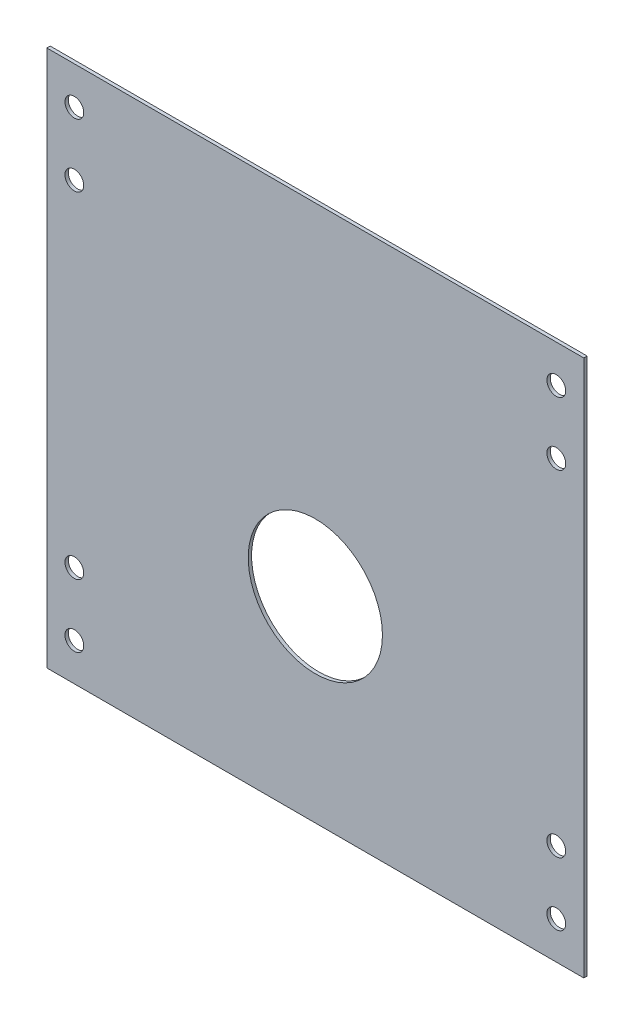
ISO-10303-21;
HEADER;
FILE_DESCRIPTION(('STEP AP214'),'2;1');
FILE_NAME('part.step','',(''),(''),'','','');
FILE_SCHEMA(('AUTOMOTIVE_DESIGN { 1 0 10303 214 1 1 1 1 }'));
ENDSEC;
DATA;
#1=APPLICATION_CONTEXT('core data for automotive mechanical design processes');
#2=APPLICATION_PROTOCOL_DEFINITION('international standard','automotive_design',2000,#1);
#3=PRODUCT_CONTEXT('',#1,'mechanical');
#4=PRODUCT('Part','Part','',(#3));
#5=PRODUCT_RELATED_PRODUCT_CATEGORY('part','',(#4));
#6=PRODUCT_DEFINITION_FORMATION('','',#4);
#7=PRODUCT_DEFINITION_CONTEXT('part definition',#1,'design');
#8=PRODUCT_DEFINITION('design','',#6,#7);
#9=PRODUCT_DEFINITION_SHAPE('','',#8);
#10=(LENGTH_UNIT() NAMED_UNIT(*) SI_UNIT(.MILLI.,.METRE.));
#11=(NAMED_UNIT(*) PLANE_ANGLE_UNIT() SI_UNIT($,.RADIAN.));
#12=(NAMED_UNIT(*) SI_UNIT($,.STERADIAN.) SOLID_ANGLE_UNIT());
#13=UNCERTAINTY_MEASURE_WITH_UNIT(LENGTH_MEASURE(1.E-05),#10,'distance_accuracy_value','');
#14=(GEOMETRIC_REPRESENTATION_CONTEXT(3) GLOBAL_UNCERTAINTY_ASSIGNED_CONTEXT((#13)) GLOBAL_UNIT_ASSIGNED_CONTEXT((#10,
#11,#12)) REPRESENTATION_CONTEXT('',''));
#15=CARTESIAN_POINT('',(0.,0.,0.));
#16=DIRECTION('',(0.,0.,1.));
#17=DIRECTION('',(1.,0.,0.));
#18=AXIS2_PLACEMENT_3D('',#15,#16,#17);
#19=CARTESIAN_POINT('',(0.,0.,2.54));
#20=DIRECTION('',(0.,0.,1.));
#21=DIRECTION('',(1.,0.,0.));
#22=AXIS2_PLACEMENT_3D('',#19,#20,#21);
#23=PLANE('',#22);
#24=CARTESIAN_POINT('',(182.372,174.752,2.54));
#25=DIRECTION('',(0.,0.,1.));
#26=DIRECTION('',(-1.,0.,0.));
#27=AXIS2_PLACEMENT_3D('',#24,#25,#26);
#28=CIRCLE('',#27,7.11200000000003);
#29=CARTESIAN_POINT('',(175.26,174.752,2.54));
#30=VERTEX_POINT('',#29);
#31=EDGE_CURVE('E150',#30,#30,#28,.T.);
#32=ORIENTED_EDGE('',*,*,#31,.F.);
#33=EDGE_LOOP('',(#32));
#34=FACE_BOUND('',#33,.T.);
#35=CARTESIAN_POINT('',(182.372,-127.,2.54));
#36=DIRECTION('',(0.,0.,1.));
#37=DIRECTION('',(1.,0.,0.));
#38=AXIS2_PLACEMENT_3D('',#35,#36,#37);
#39=CIRCLE('',#38,7.112);
#40=CARTESIAN_POINT('',(189.484,-127.,2.54));
#41=VERTEX_POINT('',#40);
#42=EDGE_CURVE('E138',#41,#41,#39,.T.);
#43=ORIENTED_EDGE('',*,*,#42,.F.);
#44=EDGE_LOOP('',(#43));
#45=FACE_BOUND('',#44,.T.);
#46=CARTESIAN_POINT('',(-182.372,-174.752,2.54));
#47=DIRECTION('',(0.,0.,1.));
#48=DIRECTION('',(-1.,0.,0.));
#49=AXIS2_PLACEMENT_3D('',#46,#47,#48);
#50=CIRCLE('',#49,7.11200000000003);
#51=CARTESIAN_POINT('',(-189.484,-174.752,2.54));
#52=VERTEX_POINT('',#51);
#53=EDGE_CURVE('E126',#52,#52,#50,.T.);
#54=ORIENTED_EDGE('',*,*,#53,.F.);
#55=EDGE_LOOP('',(#54));
#56=FACE_BOUND('',#55,.T.);
#57=CARTESIAN_POINT('',(-182.372,127.,2.54));
#58=DIRECTION('',(0.,0.,1.));
#59=DIRECTION('',(1.,0.,0.));
#60=AXIS2_PLACEMENT_3D('',#57,#58,#59);
#61=CIRCLE('',#60,7.112);
#62=CARTESIAN_POINT('',(-175.26,127.,2.54));
#63=VERTEX_POINT('',#62);
#64=EDGE_CURVE('E114',#63,#63,#61,.T.);
#65=ORIENTED_EDGE('',*,*,#64,.F.);
#66=EDGE_LOOP('',(#65));
#67=FACE_BOUND('',#66,.T.);
#68=DIRECTION('',(0.,-1.,0.));
#69=VECTOR('',#68,1.);
#70=CARTESIAN_POINT('',(-203.2,203.2,2.54));
#71=LINE('',#70,#69);
#72=CARTESIAN_POINT('',(-203.2,203.2,2.54));
#73=VERTEX_POINT('',#72);
#74=CARTESIAN_POINT('',(-203.2,-203.2,2.54));
#75=VERTEX_POINT('',#74);
#76=EDGE_CURVE('E84',#73,#75,#71,.T.);
#77=ORIENTED_EDGE('',*,*,#76,.T.);
#78=DIRECTION('',(1.,0.,0.));
#79=VECTOR('',#78,1.);
#80=CARTESIAN_POINT('',(-203.2,-203.2,2.54));
#81=LINE('',#80,#79);
#82=CARTESIAN_POINT('',(203.2,-203.2,2.54));
#83=VERTEX_POINT('',#82);
#84=EDGE_CURVE('E79',#75,#83,#81,.T.);
#85=ORIENTED_EDGE('',*,*,#84,.T.);
#86=DIRECTION('',(0.,1.,0.));
#87=VECTOR('',#86,1.);
#88=CARTESIAN_POINT('',(203.2,203.2,2.54));
#89=LINE('',#88,#87);
#90=CARTESIAN_POINT('',(203.2,203.2,2.54));
#91=VERTEX_POINT('',#90);
#92=EDGE_CURVE('E82',#83,#91,#89,.T.);
#93=ORIENTED_EDGE('',*,*,#92,.T.);
#94=DIRECTION('',(-1.,0.,0.));
#95=VECTOR('',#94,1.);
#96=CARTESIAN_POINT('',(-203.2,203.2,2.54));
#97=LINE('',#96,#95);
#98=EDGE_CURVE('E49',#91,#73,#97,.T.);
#99=ORIENTED_EDGE('',*,*,#98,.T.);
#100=EDGE_LOOP('',(#77,#85,#93,#99));
#101=FACE_BOUND('',#100,.T.);
#102=CARTESIAN_POINT('',(0.,-54.602000016,2.54));
#103=DIRECTION('',(0.,0.,1.));
#104=DIRECTION('',(1.,0.,0.));
#105=AXIS2_PLACEMENT_3D('',#102,#103,#104);
#106=CIRCLE('',#105,50.8);
#107=CARTESIAN_POINT('',(50.8,-54.602000016,2.54));
#108=VERTEX_POINT('',#107);
#109=EDGE_CURVE('E99',#108,#108,#106,.T.);
#110=ORIENTED_EDGE('',*,*,#109,.F.);
#111=EDGE_LOOP('',(#110));
#112=FACE_BOUND('',#111,.T.);
#113=CARTESIAN_POINT('',(-182.372,174.752,2.54));
#114=DIRECTION('',(0.,0.,1.));
#115=DIRECTION('',(1.,0.,0.));
#116=AXIS2_PLACEMENT_3D('',#113,#114,#115);
#117=CIRCLE('',#116,7.11200000000003);
#118=CARTESIAN_POINT('',(-175.26,174.752,2.54));
#119=VERTEX_POINT('',#118);
#120=EDGE_CURVE('E120',#119,#119,#117,.T.);
#121=ORIENTED_EDGE('',*,*,#120,.F.);
#122=EDGE_LOOP('',(#121));
#123=FACE_BOUND('',#122,.T.);
#124=CARTESIAN_POINT('',(-182.372,-127.,2.54));
#125=DIRECTION('',(0.,0.,1.));
#126=DIRECTION('',(-1.,0.,0.));
#127=AXIS2_PLACEMENT_3D('',#124,#125,#126);
#128=CIRCLE('',#127,7.112);
#129=CARTESIAN_POINT('',(-189.484,-127.,2.54));
#130=VERTEX_POINT('',#129);
#131=EDGE_CURVE('E132',#130,#130,#128,.T.);
#132=ORIENTED_EDGE('',*,*,#131,.F.);
#133=EDGE_LOOP('',(#132));
#134=FACE_BOUND('',#133,.T.);
#135=CARTESIAN_POINT('',(182.372,-174.752,2.54));
#136=DIRECTION('',(0.,0.,1.));
#137=DIRECTION('',(1.,0.,0.));
#138=AXIS2_PLACEMENT_3D('',#135,#136,#137);
#139=CIRCLE('',#138,7.11200000000003);
#140=CARTESIAN_POINT('',(189.484,-174.752,2.54));
#141=VERTEX_POINT('',#140);
#142=EDGE_CURVE('E144',#141,#141,#139,.T.);
#143=ORIENTED_EDGE('',*,*,#142,.F.);
#144=EDGE_LOOP('',(#143));
#145=FACE_BOUND('',#144,.T.);
#146=CARTESIAN_POINT('',(182.372,127.,2.54));
#147=DIRECTION('',(0.,0.,1.));
#148=DIRECTION('',(-1.,0.,0.));
#149=AXIS2_PLACEMENT_3D('',#146,#147,#148);
#150=CIRCLE('',#149,7.112);
#151=CARTESIAN_POINT('',(175.26,127.,2.54));
#152=VERTEX_POINT('',#151);
#153=EDGE_CURVE('E156',#152,#152,#150,.T.);
#154=ORIENTED_EDGE('',*,*,#153,.F.);
#155=EDGE_LOOP('',(#154));
#156=FACE_BOUND('',#155,.T.);
#157=ADVANCED_FACE('F32',(#34,#45,#56,#67,#101,#112,#123,#134,#145,#156),#23,.T.);
#158=CARTESIAN_POINT('',(0.,0.,0.));
#159=DIRECTION('',(0.,0.,1.));
#160=DIRECTION('',(1.,0.,0.));
#161=AXIS2_PLACEMENT_3D('',#158,#159,#160);
#162=PLANE('',#161);
#163=CARTESIAN_POINT('',(182.372,174.752,0.));
#164=DIRECTION('',(0.,0.,1.));
#165=DIRECTION('',(-1.,0.,0.));
#166=AXIS2_PLACEMENT_3D('',#163,#164,#165);
#167=CIRCLE('',#166,7.11200000000003);
#168=CARTESIAN_POINT('',(175.26,174.752,0.));
#169=VERTEX_POINT('',#168);
#170=EDGE_CURVE('E153',#169,#169,#167,.T.);
#171=ORIENTED_EDGE('',*,*,#170,.T.);
#172=EDGE_LOOP('',(#171));
#173=FACE_BOUND('',#172,.T.);
#174=CARTESIAN_POINT('',(182.372,-127.,0.));
#175=DIRECTION('',(0.,0.,1.));
#176=DIRECTION('',(1.,0.,0.));
#177=AXIS2_PLACEMENT_3D('',#174,#175,#176);
#178=CIRCLE('',#177,7.112);
#179=CARTESIAN_POINT('',(189.484,-127.,0.));
#180=VERTEX_POINT('',#179);
#181=EDGE_CURVE('E141',#180,#180,#178,.T.);
#182=ORIENTED_EDGE('',*,*,#181,.T.);
#183=EDGE_LOOP('',(#182));
#184=FACE_BOUND('',#183,.T.);
#185=CARTESIAN_POINT('',(-182.372,-174.752,0.));
#186=DIRECTION('',(0.,0.,1.));
#187=DIRECTION('',(-1.,0.,0.));
#188=AXIS2_PLACEMENT_3D('',#185,#186,#187);
#189=CIRCLE('',#188,7.11200000000003);
#190=CARTESIAN_POINT('',(-189.484,-174.752,0.));
#191=VERTEX_POINT('',#190);
#192=EDGE_CURVE('E129',#191,#191,#189,.T.);
#193=ORIENTED_EDGE('',*,*,#192,.T.);
#194=EDGE_LOOP('',(#193));
#195=FACE_BOUND('',#194,.T.);
#196=CARTESIAN_POINT('',(-182.372,127.,0.));
#197=DIRECTION('',(0.,0.,1.));
#198=DIRECTION('',(1.,0.,0.));
#199=AXIS2_PLACEMENT_3D('',#196,#197,#198);
#200=CIRCLE('',#199,7.112);
#201=CARTESIAN_POINT('',(-175.26,127.,0.));
#202=VERTEX_POINT('',#201);
#203=EDGE_CURVE('E117',#202,#202,#200,.T.);
#204=ORIENTED_EDGE('',*,*,#203,.T.);
#205=EDGE_LOOP('',(#204));
#206=FACE_BOUND('',#205,.T.);
#207=DIRECTION('',(0.,-1.,0.));
#208=VECTOR('',#207,1.);
#209=CARTESIAN_POINT('',(-203.2,203.2,0.));
#210=LINE('',#209,#208);
#211=CARTESIAN_POINT('',(-203.2,203.2,0.));
#212=VERTEX_POINT('',#211);
#213=CARTESIAN_POINT('',(-203.2,-203.2,0.));
#214=VERTEX_POINT('',#213);
#215=EDGE_CURVE('E96',#212,#214,#210,.T.);
#216=ORIENTED_EDGE('',*,*,#215,.F.);
#217=DIRECTION('',(-1.,0.,0.));
#218=VECTOR('',#217,1.);
#219=CARTESIAN_POINT('',(-203.2,203.2,0.));
#220=LINE('',#219,#218);
#221=CARTESIAN_POINT('',(203.2,203.2,0.));
#222=VERTEX_POINT('',#221);
#223=EDGE_CURVE('E72',#222,#212,#220,.T.);
#224=ORIENTED_EDGE('',*,*,#223,.F.);
#225=DIRECTION('',(0.,1.,0.));
#226=VECTOR('',#225,1.);
#227=CARTESIAN_POINT('',(203.2,203.2,0.));
#228=LINE('',#227,#226);
#229=CARTESIAN_POINT('',(203.2,-203.2,0.));
#230=VERTEX_POINT('',#229);
#231=EDGE_CURVE('E66',#230,#222,#228,.T.);
#232=ORIENTED_EDGE('',*,*,#231,.F.);
#233=DIRECTION('',(1.,0.,0.));
#234=VECTOR('',#233,1.);
#235=CARTESIAN_POINT('',(-203.2,-203.2,0.));
#236=LINE('',#235,#234);
#237=EDGE_CURVE('E88',#214,#230,#236,.T.);
#238=ORIENTED_EDGE('',*,*,#237,.F.);
#239=EDGE_LOOP('',(#216,#224,#232,#238));
#240=FACE_BOUND('',#239,.T.);
#241=CARTESIAN_POINT('',(0.,-54.602000016,0.));
#242=DIRECTION('',(0.,0.,1.));
#243=DIRECTION('',(1.,0.,0.));
#244=AXIS2_PLACEMENT_3D('',#241,#242,#243);
#245=CIRCLE('',#244,50.8);
#246=CARTESIAN_POINT('',(50.8,-54.602000016,0.));
#247=VERTEX_POINT('',#246);
#248=EDGE_CURVE('E111',#247,#247,#245,.T.);
#249=ORIENTED_EDGE('',*,*,#248,.T.);
#250=EDGE_LOOP('',(#249));
#251=FACE_BOUND('',#250,.T.);
#252=CARTESIAN_POINT('',(-182.372,174.752,0.));
#253=DIRECTION('',(0.,0.,1.));
#254=DIRECTION('',(1.,0.,0.));
#255=AXIS2_PLACEMENT_3D('',#252,#253,#254);
#256=CIRCLE('',#255,7.11200000000003);
#257=CARTESIAN_POINT('',(-175.26,174.752,0.));
#258=VERTEX_POINT('',#257);
#259=EDGE_CURVE('E123',#258,#258,#256,.T.);
#260=ORIENTED_EDGE('',*,*,#259,.T.);
#261=EDGE_LOOP('',(#260));
#262=FACE_BOUND('',#261,.T.);
#263=CARTESIAN_POINT('',(-182.372,-127.,0.));
#264=DIRECTION('',(0.,0.,1.));
#265=DIRECTION('',(-1.,0.,0.));
#266=AXIS2_PLACEMENT_3D('',#263,#264,#265);
#267=CIRCLE('',#266,7.112);
#268=CARTESIAN_POINT('',(-189.484,-127.,0.));
#269=VERTEX_POINT('',#268);
#270=EDGE_CURVE('E135',#269,#269,#267,.T.);
#271=ORIENTED_EDGE('',*,*,#270,.T.);
#272=EDGE_LOOP('',(#271));
#273=FACE_BOUND('',#272,.T.);
#274=CARTESIAN_POINT('',(182.372,-174.752,0.));
#275=DIRECTION('',(0.,0.,1.));
#276=DIRECTION('',(1.,0.,0.));
#277=AXIS2_PLACEMENT_3D('',#274,#275,#276);
#278=CIRCLE('',#277,7.11200000000003);
#279=CARTESIAN_POINT('',(189.484,-174.752,0.));
#280=VERTEX_POINT('',#279);
#281=EDGE_CURVE('E147',#280,#280,#278,.T.);
#282=ORIENTED_EDGE('',*,*,#281,.T.);
#283=EDGE_LOOP('',(#282));
#284=FACE_BOUND('',#283,.T.);
#285=CARTESIAN_POINT('',(182.372,127.,0.));
#286=DIRECTION('',(0.,0.,1.));
#287=DIRECTION('',(-1.,0.,0.));
#288=AXIS2_PLACEMENT_3D('',#285,#286,#287);
#289=CIRCLE('',#288,7.112);
#290=CARTESIAN_POINT('',(175.26,127.,0.));
#291=VERTEX_POINT('',#290);
#292=EDGE_CURVE('E159',#291,#291,#289,.T.);
#293=ORIENTED_EDGE('',*,*,#292,.T.);
#294=EDGE_LOOP('',(#293));
#295=FACE_BOUND('',#294,.T.);
#296=ADVANCED_FACE('F107',(#173,#184,#195,#206,#240,#251,#262,#273,#284,#295),#162,.F.);
#297=CARTESIAN_POINT('',(-203.2,203.2,2.54));
#298=DIRECTION('',(1.,0.,0.));
#299=DIRECTION('',(0.,1.,0.));
#300=AXIS2_PLACEMENT_3D('',#297,#298,#299);
#301=PLANE('',#300);
#302=ORIENTED_EDGE('',*,*,#215,.T.);
#303=DIRECTION('',(0.,0.,-1.));
#304=VECTOR('',#303,1.);
#305=CARTESIAN_POINT('',(-203.2,-203.2,2.54));
#306=LINE('',#305,#304);
#307=EDGE_CURVE('E11',#75,#214,#306,.T.);
#308=ORIENTED_EDGE('',*,*,#307,.F.);
#309=ORIENTED_EDGE('',*,*,#76,.F.);
#310=DIRECTION('',(0.,0.,-1.));
#311=VECTOR('',#310,1.);
#312=CARTESIAN_POINT('',(-203.2,203.2,2.54));
#313=LINE('',#312,#311);
#314=EDGE_CURVE('E92',#73,#212,#313,.T.);
#315=ORIENTED_EDGE('',*,*,#314,.T.);
#316=EDGE_LOOP('',(#302,#308,#309,#315));
#317=FACE_BOUND('',#316,.T.);
#318=ADVANCED_FACE('F34',(#317),#301,.F.);
#319=CARTESIAN_POINT('',(-203.2,-203.2,2.54));
#320=DIRECTION('',(0.,1.,0.));
#321=DIRECTION('',(0.,0.,1.));
#322=AXIS2_PLACEMENT_3D('',#319,#320,#321);
#323=PLANE('',#322);
#324=ORIENTED_EDGE('',*,*,#237,.T.);
#325=DIRECTION('',(0.,0.,-1.));
#326=VECTOR('',#325,1.);
#327=CARTESIAN_POINT('',(203.2,-203.2,2.54));
#328=LINE('',#327,#326);
#329=EDGE_CURVE('E41',#83,#230,#328,.T.);
#330=ORIENTED_EDGE('',*,*,#329,.F.);
#331=ORIENTED_EDGE('',*,*,#84,.F.);
#332=ORIENTED_EDGE('',*,*,#307,.T.);
#333=EDGE_LOOP('',(#324,#330,#331,#332));
#334=FACE_BOUND('',#333,.T.);
#335=ADVANCED_FACE('F87',(#334),#323,.F.);
#336=CARTESIAN_POINT('',(203.2,203.2,2.54));
#337=DIRECTION('',(-1.,0.,0.));
#338=DIRECTION('',(0.,-1.,0.));
#339=AXIS2_PLACEMENT_3D('',#336,#337,#338);
#340=PLANE('',#339);
#341=ORIENTED_EDGE('',*,*,#231,.T.);
#342=DIRECTION('',(0.,0.,-1.));
#343=VECTOR('',#342,1.);
#344=CARTESIAN_POINT('',(203.2,203.2,2.54));
#345=LINE('',#344,#343);
#346=EDGE_CURVE('E89',#91,#222,#345,.T.);
#347=ORIENTED_EDGE('',*,*,#346,.F.);
#348=ORIENTED_EDGE('',*,*,#92,.F.);
#349=ORIENTED_EDGE('',*,*,#329,.T.);
#350=EDGE_LOOP('',(#341,#347,#348,#349));
#351=FACE_BOUND('',#350,.T.);
#352=ADVANCED_FACE('F90',(#351),#340,.F.);
#353=CARTESIAN_POINT('',(-203.2,203.2,2.54));
#354=DIRECTION('',(0.,-1.,0.));
#355=DIRECTION('',(0.,0.,-1.));
#356=AXIS2_PLACEMENT_3D('',#353,#354,#355);
#357=PLANE('',#356);
#358=ORIENTED_EDGE('',*,*,#223,.T.);
#359=ORIENTED_EDGE('',*,*,#314,.F.);
#360=ORIENTED_EDGE('',*,*,#98,.F.);
#361=ORIENTED_EDGE('',*,*,#346,.T.);
#362=EDGE_LOOP('',(#358,#359,#360,#361));
#363=FACE_BOUND('',#362,.T.);
#364=ADVANCED_FACE('F104',(#363),#357,.F.);
#365=CARTESIAN_POINT('',(0.,-54.602000016,2.54));
#366=DIRECTION('',(0.,0.,-1.));
#367=DIRECTION('',(-1.,0.,0.));
#368=AXIS2_PLACEMENT_3D('',#365,#366,#367);
#369=CYLINDRICAL_SURFACE('',#368,50.8);
#370=ORIENTED_EDGE('',*,*,#109,.T.);
#371=EDGE_LOOP('',(#370));
#372=FACE_BOUND('',#371,.T.);
#373=ORIENTED_EDGE('',*,*,#248,.F.);
#374=EDGE_LOOP('',(#373));
#375=FACE_BOUND('',#374,.T.);
#376=ADVANCED_FACE('F179',(#372,#375),#369,.F.);
#377=CARTESIAN_POINT('',(-182.372,127.,2.54));
#378=DIRECTION('',(0.,0.,-1.));
#379=DIRECTION('',(-1.,0.,0.));
#380=AXIS2_PLACEMENT_3D('',#377,#378,#379);
#381=CYLINDRICAL_SURFACE('',#380,7.112);
#382=ORIENTED_EDGE('',*,*,#64,.T.);
#383=EDGE_LOOP('',(#382));
#384=FACE_BOUND('',#383,.T.);
#385=ORIENTED_EDGE('',*,*,#203,.F.);
#386=EDGE_LOOP('',(#385));
#387=FACE_BOUND('',#386,.T.);
#388=ADVANCED_FACE('F204',(#384,#387),#381,.F.);
#389=CARTESIAN_POINT('',(-182.372,174.752,2.54));
#390=DIRECTION('',(0.,0.,-1.));
#391=DIRECTION('',(-1.,0.,0.));
#392=AXIS2_PLACEMENT_3D('',#389,#390,#391);
#393=CYLINDRICAL_SURFACE('',#392,7.11200000000003);
#394=ORIENTED_EDGE('',*,*,#120,.T.);
#395=EDGE_LOOP('',(#394));
#396=FACE_BOUND('',#395,.T.);
#397=ORIENTED_EDGE('',*,*,#259,.F.);
#398=EDGE_LOOP('',(#397));
#399=FACE_BOUND('',#398,.T.);
#400=ADVANCED_FACE('F209',(#396,#399),#393,.F.);
#401=CARTESIAN_POINT('',(-182.372,-174.752,2.54));
#402=DIRECTION('',(0.,0.,-1.));
#403=DIRECTION('',(-1.,0.,0.));
#404=AXIS2_PLACEMENT_3D('',#401,#402,#403);
#405=CYLINDRICAL_SURFACE('',#404,7.11200000000003);
#406=ORIENTED_EDGE('',*,*,#53,.T.);
#407=EDGE_LOOP('',(#406));
#408=FACE_BOUND('',#407,.T.);
#409=ORIENTED_EDGE('',*,*,#192,.F.);
#410=EDGE_LOOP('',(#409));
#411=FACE_BOUND('',#410,.T.);
#412=ADVANCED_FACE('F219',(#408,#411),#405,.F.);
#413=CARTESIAN_POINT('',(-182.372,-127.,2.54));
#414=DIRECTION('',(0.,0.,-1.));
#415=DIRECTION('',(-1.,0.,0.));
#416=AXIS2_PLACEMENT_3D('',#413,#414,#415);
#417=CYLINDRICAL_SURFACE('',#416,7.112);
#418=ORIENTED_EDGE('',*,*,#131,.T.);
#419=EDGE_LOOP('',(#418));
#420=FACE_BOUND('',#419,.T.);
#421=ORIENTED_EDGE('',*,*,#270,.F.);
#422=EDGE_LOOP('',(#421));
#423=FACE_BOUND('',#422,.T.);
#424=ADVANCED_FACE('F229',(#420,#423),#417,.F.);
#425=CARTESIAN_POINT('',(182.372,-127.,2.54));
#426=DIRECTION('',(0.,0.,-1.));
#427=DIRECTION('',(-1.,0.,0.));
#428=AXIS2_PLACEMENT_3D('',#425,#426,#427);
#429=CYLINDRICAL_SURFACE('',#428,7.112);
#430=ORIENTED_EDGE('',*,*,#42,.T.);
#431=EDGE_LOOP('',(#430));
#432=FACE_BOUND('',#431,.T.);
#433=ORIENTED_EDGE('',*,*,#181,.F.);
#434=EDGE_LOOP('',(#433));
#435=FACE_BOUND('',#434,.T.);
#436=ADVANCED_FACE('F239',(#432,#435),#429,.F.);
#437=CARTESIAN_POINT('',(182.372,-174.752,2.54));
#438=DIRECTION('',(0.,0.,-1.));
#439=DIRECTION('',(-1.,0.,0.));
#440=AXIS2_PLACEMENT_3D('',#437,#438,#439);
#441=CYLINDRICAL_SURFACE('',#440,7.11200000000003);
#442=ORIENTED_EDGE('',*,*,#142,.T.);
#443=EDGE_LOOP('',(#442));
#444=FACE_BOUND('',#443,.T.);
#445=ORIENTED_EDGE('',*,*,#281,.F.);
#446=EDGE_LOOP('',(#445));
#447=FACE_BOUND('',#446,.T.);
#448=ADVANCED_FACE('F249',(#444,#447),#441,.F.);
#449=CARTESIAN_POINT('',(182.372,174.752,2.54));
#450=DIRECTION('',(0.,0.,-1.));
#451=DIRECTION('',(-1.,0.,0.));
#452=AXIS2_PLACEMENT_3D('',#449,#450,#451);
#453=CYLINDRICAL_SURFACE('',#452,7.11200000000003);
#454=ORIENTED_EDGE('',*,*,#31,.T.);
#455=EDGE_LOOP('',(#454));
#456=FACE_BOUND('',#455,.T.);
#457=ORIENTED_EDGE('',*,*,#170,.F.);
#458=EDGE_LOOP('',(#457));
#459=FACE_BOUND('',#458,.T.);
#460=ADVANCED_FACE('F259',(#456,#459),#453,.F.);
#461=CARTESIAN_POINT('',(182.372,127.,2.54));
#462=DIRECTION('',(0.,0.,-1.));
#463=DIRECTION('',(-1.,0.,0.));
#464=AXIS2_PLACEMENT_3D('',#461,#462,#463);
#465=CYLINDRICAL_SURFACE('',#464,7.112);
#466=ORIENTED_EDGE('',*,*,#153,.T.);
#467=EDGE_LOOP('',(#466));
#468=FACE_BOUND('',#467,.T.);
#469=ORIENTED_EDGE('',*,*,#292,.F.);
#470=EDGE_LOOP('',(#469));
#471=FACE_BOUND('',#470,.T.);
#472=ADVANCED_FACE('F165',(#468,#471),#465,.F.);
#473=CLOSED_SHELL('',(#157,#296,#318,#335,#352,#364,#376,#388,#400,#412,#424,#436,#448,#460,#472));
#474=MANIFOLD_SOLID_BREP('B2',#473);
#475=ADVANCED_BREP_SHAPE_REPRESENTATION('',(#18,#474),#14);
#476=SHAPE_DEFINITION_REPRESENTATION(#9,#475);
ENDSEC;
END-ISO-10303-21;
